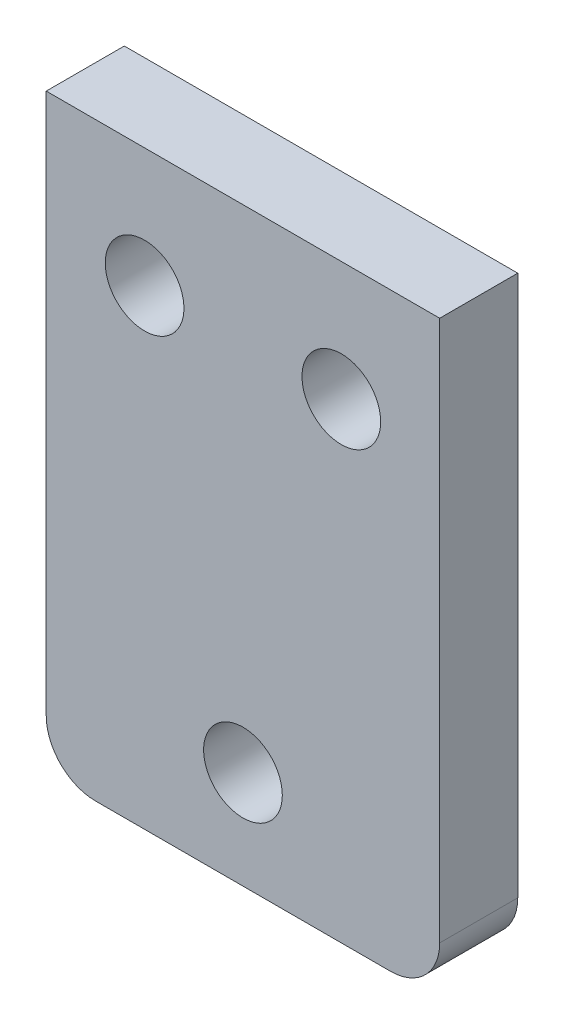
ISO-10303-21;
HEADER;
FILE_DESCRIPTION(('STEP AP214'),'2;1');
FILE_NAME('part.step','',(''),(''),'','','');
FILE_SCHEMA(('AUTOMOTIVE_DESIGN { 1 0 10303 214 1 1 1 1 }'));
ENDSEC;
DATA;
#1=APPLICATION_CONTEXT('core data for automotive mechanical design processes');
#2=APPLICATION_PROTOCOL_DEFINITION('international standard','automotive_design',2000,#1);
#3=PRODUCT_CONTEXT('',#1,'mechanical');
#4=PRODUCT('Part','Part','',(#3));
#5=PRODUCT_RELATED_PRODUCT_CATEGORY('part','',(#4));
#6=PRODUCT_DEFINITION_FORMATION('','',#4);
#7=PRODUCT_DEFINITION_CONTEXT('part definition',#1,'design');
#8=PRODUCT_DEFINITION('design','',#6,#7);
#9=PRODUCT_DEFINITION_SHAPE('','',#8);
#10=(LENGTH_UNIT() NAMED_UNIT(*) SI_UNIT(.MILLI.,.METRE.));
#11=(NAMED_UNIT(*) PLANE_ANGLE_UNIT() SI_UNIT($,.RADIAN.));
#12=(NAMED_UNIT(*) SI_UNIT($,.STERADIAN.) SOLID_ANGLE_UNIT());
#13=UNCERTAINTY_MEASURE_WITH_UNIT(LENGTH_MEASURE(1.E-05),#10,'distance_accuracy_value','');
#14=(GEOMETRIC_REPRESENTATION_CONTEXT(3) GLOBAL_UNCERTAINTY_ASSIGNED_CONTEXT((#13)) GLOBAL_UNIT_ASSIGNED_CONTEXT((#10,
#11,#12)) REPRESENTATION_CONTEXT('',''));
#15=CARTESIAN_POINT('',(0.,0.,0.));
#16=DIRECTION('',(0.,0.,1.));
#17=DIRECTION('',(1.,0.,0.));
#18=AXIS2_PLACEMENT_3D('',#15,#16,#17);
#19=CARTESIAN_POINT('',(0.,0.,3.175));
#20=DIRECTION('',(0.,0.,-1.));
#21=DIRECTION('',(-1.,0.,0.));
#22=AXIS2_PLACEMENT_3D('',#19,#20,#21);
#23=PLANE('',#22);
#24=DIRECTION('',(1.,0.,0.));
#25=VECTOR('',#24,1.);
#26=CARTESIAN_POINT('',(-8.,-50.,3.175));
#27=LINE('',#26,#25);
#28=CARTESIAN_POINT('',(-6.,-50.,3.175));
#29=VERTEX_POINT('',#28);
#30=CARTESIAN_POINT('',(6.,-50.,3.175));
#31=VERTEX_POINT('',#30);
#32=EDGE_CURVE('E133',#29,#31,#27,.T.);
#33=ORIENTED_EDGE('',*,*,#32,.T.);
#34=CARTESIAN_POINT('',(6.,-48.,3.175));
#35=DIRECTION('',(0.,0.,-1.));
#36=DIRECTION('',(-1.,0.,0.));
#37=AXIS2_PLACEMENT_3D('',#34,#35,#36);
#38=CIRCLE('',#37,2.);
#39=CARTESIAN_POINT('',(8.,-48.,3.175));
#40=VERTEX_POINT('',#39);
#41=EDGE_CURVE('E54',#31,#40,#38,.F.);
#42=ORIENTED_EDGE('',*,*,#41,.T.);
#43=DIRECTION('',(0.,1.,0.));
#44=VECTOR('',#43,1.);
#45=CARTESIAN_POINT('',(8.,-50.,3.175));
#46=LINE('',#45,#44);
#47=CARTESIAN_POINT('',(8.,-26.,3.175));
#48=VERTEX_POINT('',#47);
#49=EDGE_CURVE('E100',#40,#48,#46,.T.);
#50=ORIENTED_EDGE('',*,*,#49,.T.);
#51=DIRECTION('',(-1.,0.,0.));
#52=VECTOR('',#51,1.);
#53=CARTESIAN_POINT('',(-8.00000000000001,-26.,3.175));
#54=LINE('',#53,#52);
#55=CARTESIAN_POINT('',(-8.00000000000001,-26.,3.175));
#56=VERTEX_POINT('',#55);
#57=EDGE_CURVE('E103',#48,#56,#54,.T.);
#58=ORIENTED_EDGE('',*,*,#57,.T.);
#59=DIRECTION('',(0.,-1.,0.));
#60=VECTOR('',#59,1.);
#61=CARTESIAN_POINT('',(-8.,-50.,3.175));
#62=LINE('',#61,#60);
#63=CARTESIAN_POINT('',(-8.,-48.,3.175));
#64=VERTEX_POINT('',#63);
#65=EDGE_CURVE('E120',#56,#64,#62,.T.);
#66=ORIENTED_EDGE('',*,*,#65,.T.);
#67=CARTESIAN_POINT('',(-6.,-48.,3.175));
#68=DIRECTION('',(0.,0.,-1.));
#69=DIRECTION('',(-1.,0.,0.));
#70=AXIS2_PLACEMENT_3D('',#67,#68,#69);
#71=CIRCLE('',#70,2.);
#72=EDGE_CURVE('E148',#64,#29,#71,.F.);
#73=ORIENTED_EDGE('',*,*,#72,.T.);
#74=EDGE_LOOP('',(#33,#42,#50,#58,#66,#73));
#75=FACE_BOUND('',#74,.T.);
#76=CARTESIAN_POINT('',(3.99999999999999,-30.85,3.175));
#77=DIRECTION('',(0.,0.,1.));
#78=DIRECTION('',(1.,0.,0.));
#79=AXIS2_PLACEMENT_3D('',#76,#77,#78);
#80=CIRCLE('',#79,1.59999999999999);
#81=CARTESIAN_POINT('',(5.59999999999999,-30.85,3.175));
#82=VERTEX_POINT('',#81);
#83=EDGE_CURVE('E172',#82,#82,#80,.T.);
#84=ORIENTED_EDGE('',*,*,#83,.F.);
#85=EDGE_LOOP('',(#84));
#86=FACE_BOUND('',#85,.T.);
#87=CARTESIAN_POINT('',(-4.,-30.85,3.175));
#88=DIRECTION('',(0.,0.,1.));
#89=DIRECTION('',(-1.,0.,0.));
#90=AXIS2_PLACEMENT_3D('',#87,#88,#89);
#91=CIRCLE('',#90,1.59999999999999);
#92=CARTESIAN_POINT('',(-5.6,-30.85,3.175));
#93=VERTEX_POINT('',#92);
#94=EDGE_CURVE('E180',#93,#93,#91,.T.);
#95=ORIENTED_EDGE('',*,*,#94,.F.);
#96=EDGE_LOOP('',(#95));
#97=FACE_BOUND('',#96,.T.);
#98=CARTESIAN_POINT('',(0.,-46.,3.175));
#99=DIRECTION('',(0.,0.,1.));
#100=DIRECTION('',(1.,0.,0.));
#101=AXIS2_PLACEMENT_3D('',#98,#99,#100);
#102=CIRCLE('',#101,1.6);
#103=CARTESIAN_POINT('',(1.60000000000001,-46.,3.175));
#104=VERTEX_POINT('',#103);
#105=EDGE_CURVE('E188',#104,#104,#102,.T.);
#106=ORIENTED_EDGE('',*,*,#105,.F.);
#107=EDGE_LOOP('',(#106));
#108=FACE_BOUND('',#107,.T.);
#109=ADVANCED_FACE('F45',(#75,#86,#97,#108),#23,.F.);
#110=CARTESIAN_POINT('',(0.,0.,0.));
#111=DIRECTION('',(0.,0.,-1.));
#112=DIRECTION('',(-1.,0.,0.));
#113=AXIS2_PLACEMENT_3D('',#110,#111,#112);
#114=PLANE('',#113);
#115=CARTESIAN_POINT('',(-4.,-30.85,0.));
#116=DIRECTION('',(0.,0.,1.));
#117=DIRECTION('',(-1.,0.,0.));
#118=AXIS2_PLACEMENT_3D('',#115,#116,#117);
#119=CIRCLE('',#118,1.59999999999999);
#120=CARTESIAN_POINT('',(-5.6,-30.85,0.));
#121=VERTEX_POINT('',#120);
#122=EDGE_CURVE('E184',#121,#121,#119,.T.);
#123=ORIENTED_EDGE('',*,*,#122,.T.);
#124=EDGE_LOOP('',(#123));
#125=FACE_BOUND('',#124,.T.);
#126=DIRECTION('',(0.,1.,0.));
#127=VECTOR('',#126,1.);
#128=CARTESIAN_POINT('',(8.,-50.,0.));
#129=LINE('',#128,#127);
#130=CARTESIAN_POINT('',(8.,-48.,0.));
#131=VERTEX_POINT('',#130);
#132=CARTESIAN_POINT('',(8.,-26.,0.));
#133=VERTEX_POINT('',#132);
#134=EDGE_CURVE('E124',#131,#133,#129,.T.);
#135=ORIENTED_EDGE('',*,*,#134,.F.);
#136=CARTESIAN_POINT('',(6.,-48.,0.));
#137=DIRECTION('',(0.,0.,-1.));
#138=DIRECTION('',(-1.,0.,0.));
#139=AXIS2_PLACEMENT_3D('',#136,#137,#138);
#140=CIRCLE('',#139,2.);
#141=CARTESIAN_POINT('',(6.,-50.,0.));
#142=VERTEX_POINT('',#141);
#143=EDGE_CURVE('E139',#131,#142,#140,.T.);
#144=ORIENTED_EDGE('',*,*,#143,.T.);
#145=DIRECTION('',(1.,0.,0.));
#146=VECTOR('',#145,1.);
#147=CARTESIAN_POINT('',(-8.,-50.,0.));
#148=LINE('',#147,#146);
#149=CARTESIAN_POINT('',(-6.,-50.,0.));
#150=VERTEX_POINT('',#149);
#151=EDGE_CURVE('E111',#150,#142,#148,.T.);
#152=ORIENTED_EDGE('',*,*,#151,.F.);
#153=CARTESIAN_POINT('',(-6.,-48.,0.));
#154=DIRECTION('',(0.,0.,-1.));
#155=DIRECTION('',(-1.,0.,0.));
#156=AXIS2_PLACEMENT_3D('',#153,#154,#155);
#157=CIRCLE('',#156,2.);
#158=CARTESIAN_POINT('',(-8.,-48.,0.));
#159=VERTEX_POINT('',#158);
#160=EDGE_CURVE('E131',#150,#159,#157,.T.);
#161=ORIENTED_EDGE('',*,*,#160,.T.);
#162=DIRECTION('',(0.,-1.,0.));
#163=VECTOR('',#162,1.);
#164=CARTESIAN_POINT('',(-8.,-50.,0.));
#165=LINE('',#164,#163);
#166=CARTESIAN_POINT('',(-8.00000000000001,-26.,0.));
#167=VERTEX_POINT('',#166);
#168=EDGE_CURVE('E162',#167,#159,#165,.T.);
#169=ORIENTED_EDGE('',*,*,#168,.F.);
#170=DIRECTION('',(-1.,0.,0.));
#171=VECTOR('',#170,1.);
#172=CARTESIAN_POINT('',(-8.00000000000001,-26.,0.));
#173=LINE('',#172,#171);
#174=EDGE_CURVE('E165',#133,#167,#173,.T.);
#175=ORIENTED_EDGE('',*,*,#174,.F.);
#176=EDGE_LOOP('',(#135,#144,#152,#161,#169,#175));
#177=FACE_BOUND('',#176,.T.);
#178=CARTESIAN_POINT('',(3.99999999999999,-30.85,0.));
#179=DIRECTION('',(0.,0.,1.));
#180=DIRECTION('',(1.,0.,0.));
#181=AXIS2_PLACEMENT_3D('',#178,#179,#180);
#182=CIRCLE('',#181,1.59999999999999);
#183=CARTESIAN_POINT('',(5.59999999999999,-30.85,0.));
#184=VERTEX_POINT('',#183);
#185=EDGE_CURVE('E176',#184,#184,#182,.T.);
#186=ORIENTED_EDGE('',*,*,#185,.T.);
#187=EDGE_LOOP('',(#186));
#188=FACE_BOUND('',#187,.T.);
#189=CARTESIAN_POINT('',(0.,-46.,0.));
#190=DIRECTION('',(0.,0.,1.));
#191=DIRECTION('',(1.,0.,0.));
#192=AXIS2_PLACEMENT_3D('',#189,#190,#191);
#193=CIRCLE('',#192,1.6);
#194=CARTESIAN_POINT('',(1.60000000000001,-46.,0.));
#195=VERTEX_POINT('',#194);
#196=EDGE_CURVE('E192',#195,#195,#193,.T.);
#197=ORIENTED_EDGE('',*,*,#196,.T.);
#198=EDGE_LOOP('',(#197));
#199=FACE_BOUND('',#198,.T.);
#200=ADVANCED_FACE('F160',(#125,#177,#188,#199),#114,.T.);
#201=CARTESIAN_POINT('',(8.,-50.,3.175));
#202=DIRECTION('',(-1.,0.,0.));
#203=DIRECTION('',(0.,0.,1.));
#204=AXIS2_PLACEMENT_3D('',#201,#202,#203);
#205=PLANE('',#204);
#206=ORIENTED_EDGE('',*,*,#49,.F.);
#207=DIRECTION('',(0.,0.,-1.));
#208=VECTOR('',#207,1.);
#209=CARTESIAN_POINT('',(8.,-48.,3.175));
#210=LINE('',#209,#208);
#211=EDGE_CURVE('E127',#40,#131,#210,.T.);
#212=ORIENTED_EDGE('',*,*,#211,.T.);
#213=ORIENTED_EDGE('',*,*,#134,.T.);
#214=DIRECTION('',(0.,0.,-1.));
#215=VECTOR('',#214,1.);
#216=CARTESIAN_POINT('',(8.,-26.,3.175));
#217=LINE('',#216,#215);
#218=EDGE_CURVE('E116',#48,#133,#217,.T.);
#219=ORIENTED_EDGE('',*,*,#218,.F.);
#220=EDGE_LOOP('',(#206,#212,#213,#219));
#221=FACE_BOUND('',#220,.T.);
#222=ADVANCED_FACE('F122',(#221),#205,.F.);
#223=CARTESIAN_POINT('',(-8.00000000000001,-26.,3.175));
#224=DIRECTION('',(0.,-1.,0.));
#225=DIRECTION('',(1.,0.,0.));
#226=AXIS2_PLACEMENT_3D('',#223,#224,#225);
#227=PLANE('',#226);
#228=ORIENTED_EDGE('',*,*,#174,.T.);
#229=DIRECTION('',(0.,0.,-1.));
#230=VECTOR('',#229,1.);
#231=CARTESIAN_POINT('',(-8.00000000000001,-26.,3.175));
#232=LINE('',#231,#230);
#233=EDGE_CURVE('E118',#56,#167,#232,.T.);
#234=ORIENTED_EDGE('',*,*,#233,.F.);
#235=ORIENTED_EDGE('',*,*,#57,.F.);
#236=ORIENTED_EDGE('',*,*,#218,.T.);
#237=EDGE_LOOP('',(#228,#234,#235,#236));
#238=FACE_BOUND('',#237,.T.);
#239=ADVANCED_FACE('F115',(#238),#227,.F.);
#240=CARTESIAN_POINT('',(-8.,-50.,3.175));
#241=DIRECTION('',(1.,0.,0.));
#242=DIRECTION('',(0.,1.,0.));
#243=AXIS2_PLACEMENT_3D('',#240,#241,#242);
#244=PLANE('',#243);
#245=ORIENTED_EDGE('',*,*,#168,.T.);
#246=DIRECTION('',(0.,0.,-1.));
#247=VECTOR('',#246,1.);
#248=CARTESIAN_POINT('',(-8.,-48.,3.175));
#249=LINE('',#248,#247);
#250=EDGE_CURVE('E11',#159,#64,#249,.F.);
#251=ORIENTED_EDGE('',*,*,#250,.T.);
#252=ORIENTED_EDGE('',*,*,#65,.F.);
#253=ORIENTED_EDGE('',*,*,#233,.T.);
#254=EDGE_LOOP('',(#245,#251,#252,#253));
#255=FACE_BOUND('',#254,.T.);
#256=ADVANCED_FACE('F163',(#255),#244,.F.);
#257=CARTESIAN_POINT('',(-8.,-50.,3.175));
#258=DIRECTION('',(0.,1.,0.));
#259=DIRECTION('',(0.,0.,1.));
#260=AXIS2_PLACEMENT_3D('',#257,#258,#259);
#261=PLANE('',#260);
#262=ORIENTED_EDGE('',*,*,#151,.T.);
#263=DIRECTION('',(0.,0.,-1.));
#264=VECTOR('',#263,1.);
#265=CARTESIAN_POINT('',(6.,-50.,3.175));
#266=LINE('',#265,#264);
#267=EDGE_CURVE('E67',#142,#31,#266,.F.);
#268=ORIENTED_EDGE('',*,*,#267,.T.);
#269=ORIENTED_EDGE('',*,*,#32,.F.);
#270=DIRECTION('',(0.,0.,-1.));
#271=VECTOR('',#270,1.);
#272=CARTESIAN_POINT('',(-6.,-50.,3.175));
#273=LINE('',#272,#271);
#274=EDGE_CURVE('E142',#29,#150,#273,.T.);
#275=ORIENTED_EDGE('',*,*,#274,.T.);
#276=EDGE_LOOP('',(#262,#268,#269,#275));
#277=FACE_BOUND('',#276,.T.);
#278=ADVANCED_FACE('F154',(#277),#261,.F.);
#279=CARTESIAN_POINT('',(3.99999999999999,-30.85,3.175));
#280=DIRECTION('',(0.,0.,-1.));
#281=DIRECTION('',(-1.,0.,0.));
#282=AXIS2_PLACEMENT_3D('',#279,#280,#281);
#283=CYLINDRICAL_SURFACE('',#282,1.59999999999999);
#284=ORIENTED_EDGE('',*,*,#83,.T.);
#285=EDGE_LOOP('',(#284));
#286=FACE_BOUND('',#285,.T.);
#287=ORIENTED_EDGE('',*,*,#185,.F.);
#288=EDGE_LOOP('',(#287));
#289=FACE_BOUND('',#288,.T.);
#290=ADVANCED_FACE('F212',(#286,#289),#283,.F.);
#291=CARTESIAN_POINT('',(-4.,-30.85,3.175));
#292=DIRECTION('',(0.,0.,-1.));
#293=DIRECTION('',(-1.,0.,0.));
#294=AXIS2_PLACEMENT_3D('',#291,#292,#293);
#295=CYLINDRICAL_SURFACE('',#294,1.59999999999999);
#296=ORIENTED_EDGE('',*,*,#94,.T.);
#297=EDGE_LOOP('',(#296));
#298=FACE_BOUND('',#297,.T.);
#299=ORIENTED_EDGE('',*,*,#122,.F.);
#300=EDGE_LOOP('',(#299));
#301=FACE_BOUND('',#300,.T.);
#302=ADVANCED_FACE('F228',(#298,#301),#295,.F.);
#303=CARTESIAN_POINT('',(0.,-46.,3.175));
#304=DIRECTION('',(0.,0.,-1.));
#305=DIRECTION('',(-1.,0.,0.));
#306=AXIS2_PLACEMENT_3D('',#303,#304,#305);
#307=CYLINDRICAL_SURFACE('',#306,1.6);
#308=ORIENTED_EDGE('',*,*,#105,.T.);
#309=EDGE_LOOP('',(#308));
#310=FACE_BOUND('',#309,.T.);
#311=ORIENTED_EDGE('',*,*,#196,.F.);
#312=EDGE_LOOP('',(#311));
#313=FACE_BOUND('',#312,.T.);
#314=ADVANCED_FACE('F200',(#310,#313),#307,.F.);
#315=CARTESIAN_POINT('',(6.,-48.,3.175));
#316=DIRECTION('',(0.,0.,-1.));
#317=DIRECTION('',(-1.,0.,0.));
#318=AXIS2_PLACEMENT_3D('',#315,#316,#317);
#319=CYLINDRICAL_SURFACE('',#318,2.);
#320=ORIENTED_EDGE('',*,*,#41,.F.);
#321=ORIENTED_EDGE('',*,*,#267,.F.);
#322=ORIENTED_EDGE('',*,*,#143,.F.);
#323=ORIENTED_EDGE('',*,*,#211,.F.);
#324=EDGE_LOOP('',(#320,#321,#322,#323));
#325=FACE_BOUND('',#324,.T.);
#326=ADVANCED_FACE('F222',(#325),#319,.T.);
#327=CARTESIAN_POINT('',(-6.,-48.,3.175));
#328=DIRECTION('',(0.,0.,-1.));
#329=DIRECTION('',(-1.,0.,0.));
#330=AXIS2_PLACEMENT_3D('',#327,#328,#329);
#331=CYLINDRICAL_SURFACE('',#330,2.);
#332=ORIENTED_EDGE('',*,*,#72,.F.);
#333=ORIENTED_EDGE('',*,*,#250,.F.);
#334=ORIENTED_EDGE('',*,*,#160,.F.);
#335=ORIENTED_EDGE('',*,*,#274,.F.);
#336=EDGE_LOOP('',(#332,#333,#334,#335));
#337=FACE_BOUND('',#336,.T.);
#338=ADVANCED_FACE('F47',(#337),#331,.T.);
#339=CLOSED_SHELL('',(#109,#200,#222,#239,#256,#278,#290,#302,#314,#326,#338));
#340=MANIFOLD_SOLID_BREP('B2',#339);
#341=ADVANCED_BREP_SHAPE_REPRESENTATION('',(#18,#340),#14);
#342=SHAPE_DEFINITION_REPRESENTATION(#9,#341);
ENDSEC;
END-ISO-10303-21;
